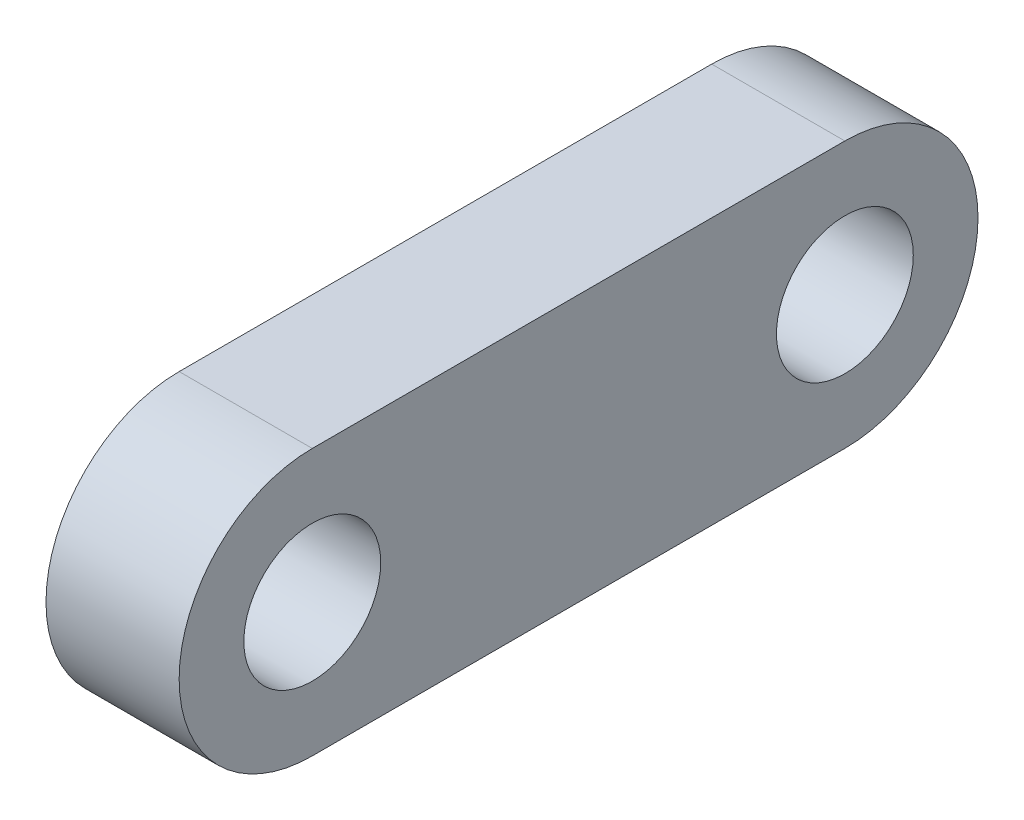
ISO-10303-21;
HEADER;
FILE_DESCRIPTION(('STEP AP214'),'2;1');
FILE_NAME('part.step','',(''),(''),'','','');
FILE_SCHEMA(('AUTOMOTIVE_DESIGN { 1 0 10303 214 1 1 1 1 }'));
ENDSEC;
DATA;
#1=APPLICATION_CONTEXT('core data for automotive mechanical design processes');
#2=APPLICATION_PROTOCOL_DEFINITION('international standard','automotive_design',2000,#1);
#3=PRODUCT_CONTEXT('',#1,'mechanical');
#4=PRODUCT('Part','Part','',(#3));
#5=PRODUCT_RELATED_PRODUCT_CATEGORY('part','',(#4));
#6=PRODUCT_DEFINITION_FORMATION('','',#4);
#7=PRODUCT_DEFINITION_CONTEXT('part definition',#1,'design');
#8=PRODUCT_DEFINITION('design','',#6,#7);
#9=PRODUCT_DEFINITION_SHAPE('','',#8);
#10=(LENGTH_UNIT() NAMED_UNIT(*) SI_UNIT(.MILLI.,.METRE.));
#11=(NAMED_UNIT(*) PLANE_ANGLE_UNIT() SI_UNIT($,.RADIAN.));
#12=(NAMED_UNIT(*) SI_UNIT($,.STERADIAN.) SOLID_ANGLE_UNIT());
#13=UNCERTAINTY_MEASURE_WITH_UNIT(LENGTH_MEASURE(1.E-05),#10,'distance_accuracy_value','');
#14=(GEOMETRIC_REPRESENTATION_CONTEXT(3) GLOBAL_UNCERTAINTY_ASSIGNED_CONTEXT((#13)) GLOBAL_UNIT_ASSIGNED_CONTEXT((#10,
#11,#12)) REPRESENTATION_CONTEXT('',''));
#15=CARTESIAN_POINT('',(0.,0.,0.));
#16=DIRECTION('',(0.,0.,1.));
#17=DIRECTION('',(1.,0.,0.));
#18=AXIS2_PLACEMENT_3D('',#15,#16,#17);
#19=CARTESIAN_POINT('',(6.35,0.,12.7));
#20=DIRECTION('',(-1.,0.,0.));
#21=DIRECTION('',(0.,0.,1.));
#22=AXIS2_PLACEMENT_3D('',#19,#20,#21);
#23=CYLINDRICAL_SURFACE('',#22,6.35);
#24=CARTESIAN_POINT('',(0.,0.,12.7));
#25=DIRECTION('',(1.,0.,0.));
#26=DIRECTION('',(0.,0.,-1.));
#27=AXIS2_PLACEMENT_3D('',#24,#25,#26);
#28=CIRCLE('',#27,6.35);
#29=CARTESIAN_POINT('',(0.,6.35,12.7));
#30=VERTEX_POINT('',#29);
#31=CARTESIAN_POINT('',(0.,-6.35,12.7));
#32=VERTEX_POINT('',#31);
#33=EDGE_CURVE('E106',#30,#32,#28,.T.);
#34=ORIENTED_EDGE('',*,*,#33,.T.);
#35=DIRECTION('',(-1.,0.,0.));
#36=VECTOR('',#35,1.);
#37=CARTESIAN_POINT('',(6.35,-6.35,12.7));
#38=LINE('',#37,#36);
#39=CARTESIAN_POINT('',(6.35,-6.35,12.7));
#40=VERTEX_POINT('',#39);
#41=EDGE_CURVE('E11',#40,#32,#38,.T.);
#42=ORIENTED_EDGE('',*,*,#41,.F.);
#43=CARTESIAN_POINT('',(6.35,0.,12.7));
#44=DIRECTION('',(1.,0.,0.));
#45=DIRECTION('',(0.,0.,-1.));
#46=AXIS2_PLACEMENT_3D('',#43,#44,#45);
#47=CIRCLE('',#46,6.35);
#48=CARTESIAN_POINT('',(6.35,6.35,12.7));
#49=VERTEX_POINT('',#48);
#50=EDGE_CURVE('E94',#49,#40,#47,.T.);
#51=ORIENTED_EDGE('',*,*,#50,.F.);
#52=DIRECTION('',(-1.,0.,0.));
#53=VECTOR('',#52,1.);
#54=CARTESIAN_POINT('',(6.35,6.35,12.7));
#55=LINE('',#54,#53);
#56=EDGE_CURVE('E102',#49,#30,#55,.T.);
#57=ORIENTED_EDGE('',*,*,#56,.T.);
#58=EDGE_LOOP('',(#34,#42,#51,#57));
#59=FACE_BOUND('',#58,.T.);
#60=ADVANCED_FACE('F43',(#59),#23,.T.);
#61=CARTESIAN_POINT('',(6.35,-6.35,12.7));
#62=DIRECTION('',(0.,1.,0.));
#63=DIRECTION('',(0.,0.,1.));
#64=AXIS2_PLACEMENT_3D('',#61,#62,#63);
#65=PLANE('',#64);
#66=DIRECTION('',(0.,0.,-1.));
#67=VECTOR('',#66,1.);
#68=CARTESIAN_POINT('',(0.,-6.35,12.7));
#69=LINE('',#68,#67);
#70=CARTESIAN_POINT('',(0.,-6.35,-12.7));
#71=VERTEX_POINT('',#70);
#72=EDGE_CURVE('E98',#32,#71,#69,.T.);
#73=ORIENTED_EDGE('',*,*,#72,.T.);
#74=DIRECTION('',(-1.,0.,0.));
#75=VECTOR('',#74,1.);
#76=CARTESIAN_POINT('',(6.35,-6.35,-12.7));
#77=LINE('',#76,#75);
#78=CARTESIAN_POINT('',(6.35,-6.35,-12.7));
#79=VERTEX_POINT('',#78);
#80=EDGE_CURVE('E51',#79,#71,#77,.T.);
#81=ORIENTED_EDGE('',*,*,#80,.F.);
#82=DIRECTION('',(0.,0.,-1.));
#83=VECTOR('',#82,1.);
#84=CARTESIAN_POINT('',(6.35,-6.35,12.7));
#85=LINE('',#84,#83);
#86=EDGE_CURVE('E89',#40,#79,#85,.T.);
#87=ORIENTED_EDGE('',*,*,#86,.F.);
#88=ORIENTED_EDGE('',*,*,#41,.T.);
#89=EDGE_LOOP('',(#73,#81,#87,#88));
#90=FACE_BOUND('',#89,.T.);
#91=ADVANCED_FACE('F97',(#90),#65,.F.);
#92=CARTESIAN_POINT('',(6.35,0.,-12.7));
#93=DIRECTION('',(-1.,0.,0.));
#94=DIRECTION('',(0.,0.,1.));
#95=AXIS2_PLACEMENT_3D('',#92,#93,#94);
#96=CYLINDRICAL_SURFACE('',#95,6.35);
#97=CARTESIAN_POINT('',(0.,0.,-12.7));
#98=DIRECTION('',(1.,0.,0.));
#99=DIRECTION('',(0.,0.,-1.));
#100=AXIS2_PLACEMENT_3D('',#97,#98,#99);
#101=CIRCLE('',#100,6.35);
#102=CARTESIAN_POINT('',(0.,6.35,-12.7));
#103=VERTEX_POINT('',#102);
#104=EDGE_CURVE('E76',#71,#103,#101,.T.);
#105=ORIENTED_EDGE('',*,*,#104,.T.);
#106=DIRECTION('',(-1.,0.,0.));
#107=VECTOR('',#106,1.);
#108=CARTESIAN_POINT('',(6.35,6.35,-12.7));
#109=LINE('',#108,#107);
#110=CARTESIAN_POINT('',(6.35,6.35,-12.7));
#111=VERTEX_POINT('',#110);
#112=EDGE_CURVE('E99',#111,#103,#109,.T.);
#113=ORIENTED_EDGE('',*,*,#112,.F.);
#114=CARTESIAN_POINT('',(6.35,0.,-12.7));
#115=DIRECTION('',(1.,0.,0.));
#116=DIRECTION('',(0.,0.,-1.));
#117=AXIS2_PLACEMENT_3D('',#114,#115,#116);
#118=CIRCLE('',#117,6.35);
#119=EDGE_CURVE('E92',#79,#111,#118,.T.);
#120=ORIENTED_EDGE('',*,*,#119,.F.);
#121=ORIENTED_EDGE('',*,*,#80,.T.);
#122=EDGE_LOOP('',(#105,#113,#120,#121));
#123=FACE_BOUND('',#122,.T.);
#124=ADVANCED_FACE('F100',(#123),#96,.T.);
#125=CARTESIAN_POINT('',(6.35,6.35,12.7));
#126=DIRECTION('',(0.,-1.,0.));
#127=DIRECTION('',(0.,0.,-1.));
#128=AXIS2_PLACEMENT_3D('',#125,#126,#127);
#129=PLANE('',#128);
#130=DIRECTION('',(0.,0.,1.));
#131=VECTOR('',#130,1.);
#132=CARTESIAN_POINT('',(0.,6.35,12.7));
#133=LINE('',#132,#131);
#134=EDGE_CURVE('E82',#103,#30,#133,.T.);
#135=ORIENTED_EDGE('',*,*,#134,.T.);
#136=ORIENTED_EDGE('',*,*,#56,.F.);
#137=DIRECTION('',(0.,0.,1.));
#138=VECTOR('',#137,1.);
#139=CARTESIAN_POINT('',(6.35,6.35,12.7));
#140=LINE('',#139,#138);
#141=EDGE_CURVE('E59',#111,#49,#140,.T.);
#142=ORIENTED_EDGE('',*,*,#141,.F.);
#143=ORIENTED_EDGE('',*,*,#112,.T.);
#144=EDGE_LOOP('',(#135,#136,#142,#143));
#145=FACE_BOUND('',#144,.T.);
#146=ADVANCED_FACE('F114',(#145),#129,.F.);
#147=CARTESIAN_POINT('',(6.35,0.,12.7));
#148=DIRECTION('',(1.,0.,0.));
#149=DIRECTION('',(0.,0.,-1.));
#150=AXIS2_PLACEMENT_3D('',#147,#148,#149);
#151=PLANE('',#150);
#152=CARTESIAN_POINT('',(6.35,0.,12.7));
#153=DIRECTION('',(1.,0.,0.));
#154=DIRECTION('',(0.,0.,-1.));
#155=AXIS2_PLACEMENT_3D('',#152,#153,#154);
#156=CIRCLE('',#155,3.2639);
#157=CARTESIAN_POINT('',(6.35,0.,9.4361));
#158=VERTEX_POINT('',#157);
#159=EDGE_CURVE('E128',#158,#158,#156,.T.);
#160=ORIENTED_EDGE('',*,*,#159,.F.);
#161=EDGE_LOOP('',(#160));
#162=FACE_BOUND('',#161,.T.);
#163=CARTESIAN_POINT('',(6.35,0.,-12.7));
#164=DIRECTION('',(1.,0.,0.));
#165=DIRECTION('',(0.,0.,-1.));
#166=AXIS2_PLACEMENT_3D('',#163,#164,#165);
#167=CIRCLE('',#166,3.2639);
#168=CARTESIAN_POINT('',(6.35,0.,-15.9639));
#169=VERTEX_POINT('',#168);
#170=EDGE_CURVE('E122',#169,#169,#167,.T.);
#171=ORIENTED_EDGE('',*,*,#170,.F.);
#172=EDGE_LOOP('',(#171));
#173=FACE_BOUND('',#172,.T.);
#174=ORIENTED_EDGE('',*,*,#50,.T.);
#175=ORIENTED_EDGE('',*,*,#86,.T.);
#176=ORIENTED_EDGE('',*,*,#119,.T.);
#177=ORIENTED_EDGE('',*,*,#141,.T.);
#178=EDGE_LOOP('',(#174,#175,#176,#177));
#179=FACE_BOUND('',#178,.T.);
#180=ADVANCED_FACE('F90',(#162,#173,#179),#151,.T.);
#181=CARTESIAN_POINT('',(0.,0.,12.7));
#182=DIRECTION('',(1.,0.,0.));
#183=DIRECTION('',(0.,0.,-1.));
#184=AXIS2_PLACEMENT_3D('',#181,#182,#183);
#185=PLANE('',#184);
#186=CARTESIAN_POINT('',(0.,0.,12.7));
#187=DIRECTION('',(1.,0.,0.));
#188=DIRECTION('',(0.,0.,-1.));
#189=AXIS2_PLACEMENT_3D('',#186,#187,#188);
#190=CIRCLE('',#189,3.2639);
#191=CARTESIAN_POINT('',(0.,0.,9.4361));
#192=VERTEX_POINT('',#191);
#193=EDGE_CURVE('E125',#192,#192,#190,.T.);
#194=ORIENTED_EDGE('',*,*,#193,.T.);
#195=EDGE_LOOP('',(#194));
#196=FACE_BOUND('',#195,.T.);
#197=CARTESIAN_POINT('',(0.,0.,-12.7));
#198=DIRECTION('',(1.,0.,0.));
#199=DIRECTION('',(0.,0.,-1.));
#200=AXIS2_PLACEMENT_3D('',#197,#198,#199);
#201=CIRCLE('',#200,3.2639);
#202=CARTESIAN_POINT('',(0.,0.,-15.9639));
#203=VERTEX_POINT('',#202);
#204=EDGE_CURVE('E109',#203,#203,#201,.T.);
#205=ORIENTED_EDGE('',*,*,#204,.T.);
#206=EDGE_LOOP('',(#205));
#207=FACE_BOUND('',#206,.T.);
#208=ORIENTED_EDGE('',*,*,#33,.F.);
#209=ORIENTED_EDGE('',*,*,#134,.F.);
#210=ORIENTED_EDGE('',*,*,#104,.F.);
#211=ORIENTED_EDGE('',*,*,#72,.F.);
#212=EDGE_LOOP('',(#208,#209,#210,#211));
#213=FACE_BOUND('',#212,.T.);
#214=ADVANCED_FACE('F117',(#196,#207,#213),#185,.F.);
#215=CARTESIAN_POINT('',(6.35,0.,-12.7));
#216=DIRECTION('',(1.,0.,0.));
#217=DIRECTION('',(0.,0.,-1.));
#218=AXIS2_PLACEMENT_3D('',#215,#216,#217);
#219=CYLINDRICAL_SURFACE('',#218,3.2639);
#220=ORIENTED_EDGE('',*,*,#204,.F.);
#221=EDGE_LOOP('',(#220));
#222=FACE_BOUND('',#221,.T.);
#223=ORIENTED_EDGE('',*,*,#170,.T.);
#224=EDGE_LOOP('',(#223));
#225=FACE_BOUND('',#224,.T.);
#226=ADVANCED_FACE('F139',(#222,#225),#219,.F.);
#227=CARTESIAN_POINT('',(6.35,0.,12.7));
#228=DIRECTION('',(1.,0.,0.));
#229=DIRECTION('',(0.,0.,-1.));
#230=AXIS2_PLACEMENT_3D('',#227,#228,#229);
#231=CYLINDRICAL_SURFACE('',#230,3.2639);
#232=ORIENTED_EDGE('',*,*,#193,.F.);
#233=EDGE_LOOP('',(#232));
#234=FACE_BOUND('',#233,.T.);
#235=ORIENTED_EDGE('',*,*,#159,.T.);
#236=EDGE_LOOP('',(#235));
#237=FACE_BOUND('',#236,.T.);
#238=ADVANCED_FACE('F132',(#234,#237),#231,.F.);
#239=CLOSED_SHELL('',(#60,#91,#124,#146,#180,#214,#226,#238));
#240=MANIFOLD_SOLID_BREP('B2',#239);
#241=ADVANCED_BREP_SHAPE_REPRESENTATION('',(#18,#240),#14);
#242=SHAPE_DEFINITION_REPRESENTATION(#9,#241);
ENDSEC;
END-ISO-10303-21;
